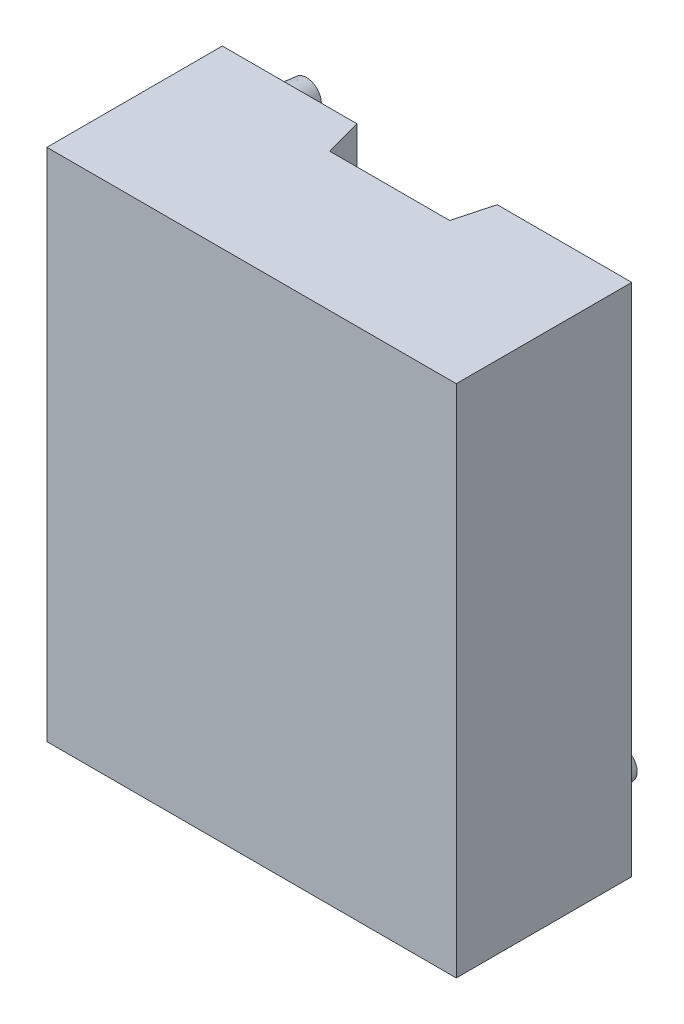
ISO-10303-21;
HEADER;
FILE_DESCRIPTION(('STEP AP214'),'2;1');
FILE_NAME('part.step','',(''),(''),'','','');
FILE_SCHEMA(('AUTOMOTIVE_DESIGN { 1 0 10303 214 1 1 1 1 }'));
ENDSEC;
DATA;
#1=APPLICATION_CONTEXT('core data for automotive mechanical design processes');
#2=APPLICATION_PROTOCOL_DEFINITION('international standard','automotive_design',2000,#1);
#3=PRODUCT_CONTEXT('',#1,'mechanical');
#4=PRODUCT('Part','Part','',(#3));
#5=PRODUCT_RELATED_PRODUCT_CATEGORY('part','',(#4));
#6=PRODUCT_DEFINITION_FORMATION('','',#4);
#7=PRODUCT_DEFINITION_CONTEXT('part definition',#1,'design');
#8=PRODUCT_DEFINITION('design','',#6,#7);
#9=PRODUCT_DEFINITION_SHAPE('','',#8);
#10=(LENGTH_UNIT() NAMED_UNIT(*) SI_UNIT(.MILLI.,.METRE.));
#11=(NAMED_UNIT(*) PLANE_ANGLE_UNIT() SI_UNIT($,.RADIAN.));
#12=(NAMED_UNIT(*) SI_UNIT($,.STERADIAN.) SOLID_ANGLE_UNIT());
#13=UNCERTAINTY_MEASURE_WITH_UNIT(LENGTH_MEASURE(1.E-05),#10,'distance_accuracy_value','');
#14=(GEOMETRIC_REPRESENTATION_CONTEXT(3) GLOBAL_UNCERTAINTY_ASSIGNED_CONTEXT((#13)) GLOBAL_UNIT_ASSIGNED_CONTEXT((#10,
#11,#12)) REPRESENTATION_CONTEXT('',''));
#15=CARTESIAN_POINT('',(0.,0.,0.));
#16=DIRECTION('',(0.,0.,1.));
#17=DIRECTION('',(1.,0.,0.));
#18=AXIS2_PLACEMENT_3D('',#15,#16,#17);
#19=CARTESIAN_POINT('',(0.,0.,0.));
#20=DIRECTION('',(0.,0.,1.));
#21=DIRECTION('',(1.,0.,0.));
#22=AXIS2_PLACEMENT_3D('',#19,#20,#21);
#23=PLANE('',#22);
#24=CARTESIAN_POINT('',(67.5,51.2727272727273,0.));
#25=DIRECTION('',(0.,0.,1.));
#26=DIRECTION('',(1.,0.,0.));
#27=AXIS2_PLACEMENT_3D('',#24,#25,#26);
#28=CIRCLE('',#27,8.);
#29=CARTESIAN_POINT('',(75.5,51.2727272727273,0.));
#30=VERTEX_POINT('',#29);
#31=EDGE_CURVE('E201',#30,#30,#28,.F.);
#32=ORIENTED_EDGE('',*,*,#31,.F.);
#33=EDGE_LOOP('',(#32));
#34=FACE_BOUND('',#33,.T.);
#35=DIRECTION('',(-1.,0.,0.));
#36=VECTOR('',#35,1.);
#37=CARTESIAN_POINT('',(60.,215.555555555556,0.));
#38=LINE('',#37,#36);
#39=CARTESIAN_POINT('',(60.,215.555555555556,0.));
#40=VERTEX_POINT('',#39);
#41=CARTESIAN_POINT('',(30.,215.555555555556,0.));
#42=VERTEX_POINT('',#41);
#43=EDGE_CURVE('E295',#40,#42,#38,.T.);
#44=ORIENTED_EDGE('',*,*,#43,.T.);
#45=DIRECTION('',(0.,1.,0.));
#46=VECTOR('',#45,1.);
#47=CARTESIAN_POINT('',(30.,212.370578729323,0.));
#48=LINE('',#47,#46);
#49=CARTESIAN_POINT('',(30.,247.272727272727,0.));
#50=VERTEX_POINT('',#49);
#51=EDGE_CURVE('E243',#42,#50,#48,.T.);
#52=ORIENTED_EDGE('',*,*,#51,.T.);
#53=DIRECTION('',(1.,0.,0.));
#54=VECTOR('',#53,1.);
#55=CARTESIAN_POINT('',(87.5,247.272727272727,0.));
#56=LINE('',#55,#54);
#57=CARTESIAN_POINT('',(87.5,247.272727272727,0.));
#58=VERTEX_POINT('',#57);
#59=EDGE_CURVE('E314',#50,#58,#56,.T.);
#60=ORIENTED_EDGE('',*,*,#59,.T.);
#61=DIRECTION('',(0.,-1.,0.));
#62=VECTOR('',#61,1.);
#63=CARTESIAN_POINT('',(87.5,27.2727272727273,0.));
#64=LINE('',#63,#62);
#65=CARTESIAN_POINT('',(87.5,27.2727272727273,0.));
#66=VERTEX_POINT('',#65);
#67=EDGE_CURVE('E211',#58,#66,#64,.T.);
#68=ORIENTED_EDGE('',*,*,#67,.T.);
#69=DIRECTION('',(-1.,0.,0.));
#70=VECTOR('',#69,1.);
#71=CARTESIAN_POINT('',(87.5,27.2727272727273,0.));
#72=LINE('',#71,#70);
#73=CARTESIAN_POINT('',(40.4040404040404,27.2727272727273,0.));
#74=VERTEX_POINT('',#73);
#75=EDGE_CURVE('E207',#66,#74,#72,.T.);
#76=ORIENTED_EDGE('',*,*,#75,.T.);
#77=DIRECTION('',(0.,1.,0.));
#78=VECTOR('',#77,1.);
#79=CARTESIAN_POINT('',(40.4040404040404,155.555555555556,0.));
#80=LINE('',#79,#78);
#81=CARTESIAN_POINT('',(40.4040404040404,52.6332114091182,0.));
#82=VERTEX_POINT('',#81);
#83=EDGE_CURVE('E210',#74,#82,#80,.T.);
#84=ORIENTED_EDGE('',*,*,#83,.T.);
#85=CARTESIAN_POINT('',(34.3434343434344,52.6332114091182,0.));
#86=DIRECTION('',(0.,0.,1.));
#87=DIRECTION('',(1.,0.,0.));
#88=AXIS2_PLACEMENT_3D('',#85,#86,#87);
#89=CIRCLE('',#88,6.06060606060606);
#90=CARTESIAN_POINT('',(40.2366907190739,54.0475929392717,0.));
#91=VERTEX_POINT('',#90);
#92=EDGE_CURVE('E276',#82,#91,#89,.T.);
#93=ORIENTED_EDGE('',*,*,#92,.T.);
#94=DIRECTION('',(-0.233372952475325,0.972387301980517,0.));
#95=VECTOR('',#94,1.);
#96=CARTESIAN_POINT('',(0.,221.700470935412,0.));
#97=LINE('',#96,#95);
#98=CARTESIAN_POINT('',(30.4703799879969,94.7405543187591,0.));
#99=VERTEX_POINT('',#98);
#100=EDGE_CURVE('E272',#91,#99,#97,.T.);
#101=ORIENTED_EDGE('',*,*,#100,.T.);
#102=CARTESIAN_POINT('',(36.3636363636364,96.1549358489125,0.));
#103=DIRECTION('',(0.,0.,1.));
#104=DIRECTION('',(1.,0.,0.));
#105=AXIS2_PLACEMENT_3D('',#102,#103,#104);
#106=CIRCLE('',#105,6.06060606060606);
#107=CARTESIAN_POINT('',(30.3030303030303,96.1549358489125,0.));
#108=VERTEX_POINT('',#107);
#109=EDGE_CURVE('E174',#108,#99,#106,.T.);
#110=ORIENTED_EDGE('',*,*,#109,.F.);
#111=DIRECTION('',(0.,1.,0.));
#112=VECTOR('',#111,1.);
#113=CARTESIAN_POINT('',(30.3030303030303,155.555555555556,0.));
#114=LINE('',#113,#112);
#115=CARTESIAN_POINT('',(30.3030303030303,185.555555555556,0.));
#116=VERTEX_POINT('',#115);
#117=EDGE_CURVE('E61',#108,#116,#114,.T.);
#118=ORIENTED_EDGE('',*,*,#117,.T.);
#119=DIRECTION('',(1.,0.,0.));
#120=VECTOR('',#119,1.);
#121=CARTESIAN_POINT('',(60.,185.555555555556,0.));
#122=LINE('',#121,#120);
#123=CARTESIAN_POINT('',(60.,185.555555555556,0.));
#124=VERTEX_POINT('',#123);
#125=EDGE_CURVE('E347',#124,#116,#122,.F.);
#126=ORIENTED_EDGE('',*,*,#125,.F.);
#127=DIRECTION('',(0.,1.,0.));
#128=VECTOR('',#127,1.);
#129=CARTESIAN_POINT('',(60.,185.555555555556,0.));
#130=LINE('',#129,#128);
#131=EDGE_CURVE('E297',#124,#40,#130,.T.);
#132=ORIENTED_EDGE('',*,*,#131,.T.);
#133=EDGE_LOOP('',(#44,#52,#60,#68,#76,#84,#93,#101,#110,#118,#126,#132));
#134=FACE_BOUND('',#133,.T.);
#135=ADVANCED_FACE('F37',(#34,#134),#23,.F.);
#136=CARTESIAN_POINT('',(87.5,27.2727272727273,75.));
#137=DIRECTION('',(0.,-1.,0.));
#138=DIRECTION('',(1.,0.,0.));
#139=AXIS2_PLACEMENT_3D('',#136,#137,#138);
#140=PLANE('',#139);
#141=CARTESIAN_POINT('',(60.,27.2727272727273,50.));
#142=DIRECTION('',(0.,-1.,0.));
#143=DIRECTION('',(1.,0.,0.));
#144=AXIS2_PLACEMENT_3D('',#141,#142,#143);
#145=CIRCLE('',#144,8.00000000000001);
#146=CARTESIAN_POINT('',(68.,27.2727272727273,50.));
#147=VERTEX_POINT('',#146);
#148=EDGE_CURVE('E246',#147,#147,#145,.T.);
#149=ORIENTED_EDGE('',*,*,#148,.F.);
#150=EDGE_LOOP('',(#149));
#151=FACE_BOUND('',#150,.T.);
#152=CARTESIAN_POINT('',(-60.,27.2727272727273,50.));
#153=DIRECTION('',(0.,-1.,0.));
#154=DIRECTION('',(1.,0.,0.));
#155=AXIS2_PLACEMENT_3D('',#152,#153,#154);
#156=CIRCLE('',#155,8.);
#157=CARTESIAN_POINT('',(-52.,27.2727272727273,50.));
#158=VERTEX_POINT('',#157);
#159=EDGE_CURVE('E260',#158,#158,#156,.T.);
#160=ORIENTED_EDGE('',*,*,#159,.F.);
#161=EDGE_LOOP('',(#160));
#162=FACE_BOUND('',#161,.T.);
#163=CARTESIAN_POINT('',(0.,27.2727272727273,0.));
#164=DIRECTION('',(0.,1.,0.));
#165=DIRECTION('',(0.,0.,1.));
#166=AXIS2_PLACEMENT_3D('',#163,#164,#165);
#167=CIRCLE('',#166,40.4040404040404);
#168=CARTESIAN_POINT('',(-40.4040404040404,27.2727272727273,0.));
#169=VERTEX_POINT('',#168);
#170=EDGE_CURVE('E191',#169,#74,#167,.T.);
#171=ORIENTED_EDGE('',*,*,#170,.T.);
#172=ORIENTED_EDGE('',*,*,#75,.F.);
#173=DIRECTION('',(0.,0.,-1.));
#174=VECTOR('',#173,1.);
#175=CARTESIAN_POINT('',(87.5,27.2727272727273,75.));
#176=LINE('',#175,#174);
#177=CARTESIAN_POINT('',(87.5,27.2727272727273,75.));
#178=VERTEX_POINT('',#177);
#179=EDGE_CURVE('E299',#178,#66,#176,.T.);
#180=ORIENTED_EDGE('',*,*,#179,.F.);
#181=DIRECTION('',(-1.,0.,0.));
#182=VECTOR('',#181,1.);
#183=CARTESIAN_POINT('',(87.5,27.2727272727273,75.));
#184=LINE('',#183,#182);
#185=CARTESIAN_POINT('',(-87.5,27.2727272727273,75.));
#186=VERTEX_POINT('',#185);
#187=EDGE_CURVE('E193',#178,#186,#184,.T.);
#188=ORIENTED_EDGE('',*,*,#187,.T.);
#189=DIRECTION('',(0.,0.,-1.));
#190=VECTOR('',#189,1.);
#191=CARTESIAN_POINT('',(-87.5,27.2727272727273,75.));
#192=LINE('',#191,#190);
#193=CARTESIAN_POINT('',(-87.5,27.2727272727273,0.));
#194=VERTEX_POINT('',#193);
#195=EDGE_CURVE('E298',#186,#194,#192,.T.);
#196=ORIENTED_EDGE('',*,*,#195,.T.);
#197=EDGE_CURVE('E212',#169,#194,#72,.T.);
#198=ORIENTED_EDGE('',*,*,#197,.F.);
#199=EDGE_LOOP('',(#171,#172,#180,#188,#196,#198));
#200=FACE_BOUND('',#199,.T.);
#201=ADVANCED_FACE('F39',(#151,#162,#200),#140,.T.);
#202=CARTESIAN_POINT('',(-67.5,231.272727272727,0.));
#203=DIRECTION('',(0.,0.,1.));
#204=DIRECTION('',(1.,0.,0.));
#205=AXIS2_PLACEMENT_3D('',#202,#203,#204);
#206=CIRCLE('',#205,8.);
#207=CARTESIAN_POINT('',(-59.5,231.272727272727,0.));
#208=VERTEX_POINT('',#207);
#209=EDGE_CURVE('E215',#208,#208,#206,.F.);
#210=ORIENTED_EDGE('',*,*,#209,.F.);
#211=EDGE_LOOP('',(#210));
#212=FACE_BOUND('',#211,.T.);
#213=CARTESIAN_POINT('',(-87.5,247.272727272727,0.));
#214=VERTEX_POINT('',#213);
#215=CARTESIAN_POINT('',(-30.,247.272727272727,0.));
#216=VERTEX_POINT('',#215);
#217=EDGE_CURVE('E311',#214,#216,#56,.T.);
#218=ORIENTED_EDGE('',*,*,#217,.T.);
#219=DIRECTION('',(0.,1.,0.));
#220=VECTOR('',#219,1.);
#221=CARTESIAN_POINT('',(-30.,212.370578729323,0.));
#222=LINE('',#221,#220);
#223=CARTESIAN_POINT('',(-30.,215.555555555556,0.));
#224=VERTEX_POINT('',#223);
#225=EDGE_CURVE('E248',#224,#216,#222,.T.);
#226=ORIENTED_EDGE('',*,*,#225,.F.);
#227=CARTESIAN_POINT('',(-60.,215.555555555556,0.));
#228=VERTEX_POINT('',#227);
#229=EDGE_CURVE('E352',#224,#228,#38,.T.);
#230=ORIENTED_EDGE('',*,*,#229,.T.);
#231=DIRECTION('',(0.,1.,0.));
#232=VECTOR('',#231,1.);
#233=CARTESIAN_POINT('',(-60.,185.555555555556,0.));
#234=LINE('',#233,#232);
#235=CARTESIAN_POINT('',(-60.,185.555555555556,0.));
#236=VERTEX_POINT('',#235);
#237=EDGE_CURVE('E355',#236,#228,#234,.T.);
#238=ORIENTED_EDGE('',*,*,#237,.F.);
#239=DIRECTION('',(1.,0.,0.));
#240=VECTOR('',#239,1.);
#241=CARTESIAN_POINT('',(60.,185.555555555556,0.));
#242=LINE('',#241,#240);
#243=CARTESIAN_POINT('',(-30.3030303030303,185.555555555556,0.));
#244=VERTEX_POINT('',#243);
#245=EDGE_CURVE('E358',#244,#236,#242,.F.);
#246=ORIENTED_EDGE('',*,*,#245,.F.);
#247=DIRECTION('',(0.,1.,0.));
#248=VECTOR('',#247,1.);
#249=CARTESIAN_POINT('',(-30.3030303030303,155.555555555556,0.));
#250=LINE('',#249,#248);
#251=CARTESIAN_POINT('',(-30.3030303030303,96.1549358489125,0.));
#252=VERTEX_POINT('',#251);
#253=EDGE_CURVE('E287',#244,#252,#250,.F.);
#254=ORIENTED_EDGE('',*,*,#253,.T.);
#255=CARTESIAN_POINT('',(-36.3636363636364,96.1549358489125,0.));
#256=DIRECTION('',(0.,0.,1.));
#257=DIRECTION('',(1.,0.,0.));
#258=AXIS2_PLACEMENT_3D('',#255,#256,#257);
#259=CIRCLE('',#258,6.06060606060606);
#260=CARTESIAN_POINT('',(-30.4703799879969,94.7405543187591,0.));
#261=VERTEX_POINT('',#260);
#262=EDGE_CURVE('E183',#261,#252,#259,.T.);
#263=ORIENTED_EDGE('',*,*,#262,.F.);
#264=DIRECTION('',(-0.233372952475325,-0.972387301980517,0.));
#265=VECTOR('',#264,1.);
#266=CARTESIAN_POINT('',(0.,221.700470935412,0.));
#267=LINE('',#266,#265);
#268=CARTESIAN_POINT('',(-40.2366907190739,54.0475929392717,0.));
#269=VERTEX_POINT('',#268);
#270=EDGE_CURVE('E283',#261,#269,#267,.T.);
#271=ORIENTED_EDGE('',*,*,#270,.T.);
#272=CARTESIAN_POINT('',(-34.3434343434344,52.6332114091182,0.));
#273=DIRECTION('',(0.,0.,1.));
#274=DIRECTION('',(1.,0.,0.));
#275=AXIS2_PLACEMENT_3D('',#272,#273,#274);
#276=CIRCLE('',#275,6.06060606060606);
#277=CARTESIAN_POINT('',(-40.4040404040404,52.6332114091182,0.));
#278=VERTEX_POINT('',#277);
#279=EDGE_CURVE('E286',#269,#278,#276,.T.);
#280=ORIENTED_EDGE('',*,*,#279,.T.);
#281=DIRECTION('',(0.,1.,0.));
#282=VECTOR('',#281,1.);
#283=CARTESIAN_POINT('',(-40.4040404040404,155.555555555556,0.));
#284=LINE('',#283,#282);
#285=EDGE_CURVE('E290',#278,#169,#284,.F.);
#286=ORIENTED_EDGE('',*,*,#285,.T.);
#287=ORIENTED_EDGE('',*,*,#197,.T.);
#288=DIRECTION('',(0.,1.,0.));
#289=VECTOR('',#288,1.);
#290=CARTESIAN_POINT('',(-87.5,27.2727272727273,0.));
#291=LINE('',#290,#289);
#292=EDGE_CURVE('E315',#194,#214,#291,.T.);
#293=ORIENTED_EDGE('',*,*,#292,.T.);
#294=EDGE_LOOP('',(#218,#226,#230,#238,#246,#254,#263,#271,#280,#286,#287,#293));
#295=FACE_BOUND('',#294,.T.);
#296=ADVANCED_FACE('F428',(#212,#295),#23,.F.);
#297=CARTESIAN_POINT('',(87.5,27.2727272727273,75.));
#298=DIRECTION('',(1.,0.,0.));
#299=DIRECTION('',(0.,0.,-1.));
#300=AXIS2_PLACEMENT_3D('',#297,#298,#299);
#301=PLANE('',#300);
#302=ORIENTED_EDGE('',*,*,#67,.F.);
#303=DIRECTION('',(0.,0.,-1.));
#304=VECTOR('',#303,1.);
#305=CARTESIAN_POINT('',(87.5,247.272727272727,75.));
#306=LINE('',#305,#304);
#307=CARTESIAN_POINT('',(87.5,247.272727272727,75.));
#308=VERTEX_POINT('',#307);
#309=EDGE_CURVE('E308',#308,#58,#306,.T.);
#310=ORIENTED_EDGE('',*,*,#309,.F.);
#311=DIRECTION('',(0.,-1.,0.));
#312=VECTOR('',#311,1.);
#313=CARTESIAN_POINT('',(87.5,27.2727272727273,75.));
#314=LINE('',#313,#312);
#315=EDGE_CURVE('E275',#308,#178,#314,.T.);
#316=ORIENTED_EDGE('',*,*,#315,.T.);
#317=ORIENTED_EDGE('',*,*,#179,.T.);
#318=EDGE_LOOP('',(#302,#310,#316,#317));
#319=FACE_BOUND('',#318,.T.);
#320=ADVANCED_FACE('F422',(#319),#301,.T.);
#321=CARTESIAN_POINT('',(87.5,247.272727272727,75.));
#322=DIRECTION('',(0.,1.,0.));
#323=DIRECTION('',(-1.,0.,0.));
#324=AXIS2_PLACEMENT_3D('',#321,#322,#323);
#325=PLANE('',#324);
#326=DIRECTION('',(0.258819045102521,0.,-0.965925826289068));
#327=VECTOR('',#326,1.);
#328=CARTESIAN_POINT('',(25.7128129211021,247.272727272727,16.));
#329=LINE('',#328,#327);
#330=CARTESIAN_POINT('',(25.7128129211021,247.272727272727,16.));
#331=VERTEX_POINT('',#330);
#332=EDGE_CURVE('E254',#331,#50,#329,.T.);
#333=ORIENTED_EDGE('',*,*,#332,.F.);
#334=DIRECTION('',(1.,0.,0.));
#335=VECTOR('',#334,1.);
#336=CARTESIAN_POINT('',(-25.712812921102,247.272727272727,16.));
#337=LINE('',#336,#335);
#338=CARTESIAN_POINT('',(-25.712812921102,247.272727272727,16.));
#339=VERTEX_POINT('',#338);
#340=EDGE_CURVE('E239',#339,#331,#337,.T.);
#341=ORIENTED_EDGE('',*,*,#340,.F.);
#342=DIRECTION('',(0.258819045102522,0.,0.965925826289068));
#343=VECTOR('',#342,1.);
#344=CARTESIAN_POINT('',(-30.,247.272727272727,0.));
#345=LINE('',#344,#343);
#346=EDGE_CURVE('E644',#216,#339,#345,.T.);
#347=ORIENTED_EDGE('',*,*,#346,.F.);
#348=ORIENTED_EDGE('',*,*,#217,.F.);
#349=DIRECTION('',(0.,0.,-1.));
#350=VECTOR('',#349,1.);
#351=CARTESIAN_POINT('',(-87.5,247.272727272727,75.));
#352=LINE('',#351,#350);
#353=CARTESIAN_POINT('',(-87.5,247.272727272727,75.));
#354=VERTEX_POINT('',#353);
#355=EDGE_CURVE('E166',#354,#214,#352,.T.);
#356=ORIENTED_EDGE('',*,*,#355,.F.);
#357=DIRECTION('',(1.,0.,0.));
#358=VECTOR('',#357,1.);
#359=CARTESIAN_POINT('',(87.5,247.272727272727,75.));
#360=LINE('',#359,#358);
#361=EDGE_CURVE('E302',#354,#308,#360,.T.);
#362=ORIENTED_EDGE('',*,*,#361,.T.);
#363=ORIENTED_EDGE('',*,*,#309,.T.);
#364=ORIENTED_EDGE('',*,*,#59,.F.);
#365=EDGE_LOOP('',(#333,#341,#347,#348,#356,#362,#363,#364));
#366=FACE_BOUND('',#365,.T.);
#367=ADVANCED_FACE('F417',(#366),#325,.T.);
#368=CARTESIAN_POINT('',(-87.5,27.2727272727273,75.));
#369=DIRECTION('',(-1.,0.,0.));
#370=DIRECTION('',(0.,-1.,0.));
#371=AXIS2_PLACEMENT_3D('',#368,#369,#370);
#372=PLANE('',#371);
#373=ORIENTED_EDGE('',*,*,#292,.F.);
#374=ORIENTED_EDGE('',*,*,#195,.F.);
#375=DIRECTION('',(0.,1.,0.));
#376=VECTOR('',#375,1.);
#377=CARTESIAN_POINT('',(-87.5,27.2727272727273,75.));
#378=LINE('',#377,#376);
#379=EDGE_CURVE('E307',#186,#354,#378,.T.);
#380=ORIENTED_EDGE('',*,*,#379,.T.);
#381=ORIENTED_EDGE('',*,*,#355,.T.);
#382=EDGE_LOOP('',(#373,#374,#380,#381));
#383=FACE_BOUND('',#382,.T.);
#384=ADVANCED_FACE('F496',(#383),#372,.T.);
#385=CARTESIAN_POINT('',(0.,0.,75.));
#386=DIRECTION('',(0.,0.,1.));
#387=DIRECTION('',(1.,0.,0.));
#388=AXIS2_PLACEMENT_3D('',#385,#386,#387);
#389=PLANE('',#388);
#390=ORIENTED_EDGE('',*,*,#315,.F.);
#391=ORIENTED_EDGE('',*,*,#361,.F.);
#392=ORIENTED_EDGE('',*,*,#379,.F.);
#393=ORIENTED_EDGE('',*,*,#187,.F.);
#394=EDGE_LOOP('',(#390,#391,#392,#393));
#395=FACE_BOUND('',#394,.T.);
#396=ADVANCED_FACE('F499',(#395),#389,.T.);
#397=CARTESIAN_POINT('',(0.,155.555555555556,0.));
#398=DIRECTION('',(0.,-1.,0.));
#399=DIRECTION('',(0.,0.,-1.));
#400=AXIS2_PLACEMENT_3D('',#397,#398,#399);
#401=PLANE('',#400);
#402=DIRECTION('',(0.104528463267654,0.,0.994521895368273));
#403=VECTOR('',#402,1.);
#404=CARTESIAN_POINT('',(-30.1370271323719,155.555555555556,3.1675291899289));
#405=LINE('',#404,#403);
#406=CARTESIAN_POINT('',(-30.1370271323719,155.555555555556,3.1675291899289));
#407=VERTEX_POINT('',#406);
#408=CARTESIAN_POINT('',(-27.2849710393285,155.555555555556,30.3030303030303));
#409=VERTEX_POINT('',#408);
#410=EDGE_CURVE('E159',#407,#409,#405,.T.);
#411=ORIENTED_EDGE('',*,*,#410,.T.);
#412=DIRECTION('',(1.,0.,0.));
#413=VECTOR('',#412,1.);
#414=CARTESIAN_POINT('',(-27.2849710393285,155.555555555556,30.3030303030303));
#415=LINE('',#414,#413);
#416=CARTESIAN_POINT('',(0.,155.555555555556,30.3030303030303));
#417=VERTEX_POINT('',#416);
#418=EDGE_CURVE('E165',#409,#417,#415,.T.);
#419=ORIENTED_EDGE('',*,*,#418,.T.);
#420=CARTESIAN_POINT('',(0.,155.555555555556,0.));
#421=DIRECTION('',(0.,-1.,0.));
#422=DIRECTION('',(0.,0.,-1.));
#423=AXIS2_PLACEMENT_3D('',#420,#421,#422);
#424=CIRCLE('',#423,30.3030303030303);
#425=EDGE_CURVE('E149',#407,#417,#424,.F.);
#426=ORIENTED_EDGE('',*,*,#425,.F.);
#427=EDGE_LOOP('',(#411,#419,#426));
#428=FACE_BOUND('',#427,.T.);
#429=ADVANCED_FACE('F168',(#428),#401,.F.);
#430=CARTESIAN_POINT('',(27.2849710393285,155.555555555556,30.3030303030303));
#431=VERTEX_POINT('',#430);
#432=EDGE_CURVE('E205',#417,#431,#415,.T.);
#433=ORIENTED_EDGE('',*,*,#432,.T.);
#434=DIRECTION('',(0.104528463267654,0.,-0.994521895368273));
#435=VECTOR('',#434,1.);
#436=CARTESIAN_POINT('',(30.1370271323719,155.555555555556,3.1675291899289));
#437=LINE('',#436,#435);
#438=CARTESIAN_POINT('',(30.1370271323719,155.555555555556,3.1675291899289));
#439=VERTEX_POINT('',#438);
#440=EDGE_CURVE('E202',#431,#439,#437,.T.);
#441=ORIENTED_EDGE('',*,*,#440,.T.);
#442=EDGE_CURVE('E170',#417,#439,#424,.F.);
#443=ORIENTED_EDGE('',*,*,#442,.F.);
#444=EDGE_LOOP('',(#433,#441,#443));
#445=FACE_BOUND('',#444,.T.);
#446=ADVANCED_FACE('F446',(#445),#401,.F.);
#447=CARTESIAN_POINT('',(-30.1370271323719,155.555555555556,3.1675291899289));
#448=DIRECTION('',(-0.994521895368273,0.,0.104528463267654));
#449=DIRECTION('',(0.104528463267654,0.,0.994521895368273));
#450=AXIS2_PLACEMENT_3D('',#447,#448,#449);
#451=PLANE('',#450);
#452=DIRECTION('',(-0.103962051184499,-0.103962051184498,-0.989132844377854));
#453=VECTOR('',#452,1.);
#454=CARTESIAN_POINT('',(-29.4921388904512,186.533364530665,9.30323095580581));
#455=LINE('',#454,#453);
#456=CARTESIAN_POINT('',(-30.1370271323719,185.888476288745,3.1675291899289));
#457=VERTEX_POINT('',#456);
#458=CARTESIAN_POINT('',(-27.2849710393285,188.740532381788,30.3030303030303));
#459=VERTEX_POINT('',#458);
#460=EDGE_CURVE('E156',#457,#459,#455,.F.);
#461=ORIENTED_EDGE('',*,*,#460,.T.);
#462=DIRECTION('',(0.,1.,0.));
#463=VECTOR('',#462,1.);
#464=CARTESIAN_POINT('',(-27.2849710393285,155.555555555556,30.3030303030303));
#465=LINE('',#464,#463);
#466=EDGE_CURVE('E161',#409,#459,#465,.T.);
#467=ORIENTED_EDGE('',*,*,#466,.F.);
#468=ORIENTED_EDGE('',*,*,#410,.F.);
#469=DIRECTION('',(0.,1.,0.));
#470=VECTOR('',#469,1.);
#471=CARTESIAN_POINT('',(-30.1370271323719,155.555555555556,3.1675291899289));
#472=LINE('',#471,#470);
#473=EDGE_CURVE('E145',#407,#457,#472,.T.);
#474=ORIENTED_EDGE('',*,*,#473,.T.);
#475=EDGE_LOOP('',(#461,#467,#468,#474));
#476=FACE_BOUND('',#475,.T.);
#477=ADVANCED_FACE('F160',(#476),#451,.F.);
#478=CARTESIAN_POINT('',(30.1370271323719,155.555555555556,3.1675291899289));
#479=DIRECTION('',(0.994521895368273,0.,0.104528463267654));
#480=DIRECTION('',(0.104528463267654,0.,-0.994521895368273));
#481=AXIS2_PLACEMENT_3D('',#478,#479,#480);
#482=PLANE('',#481);
#483=DIRECTION('',(-0.103962051184499,0.103962051184498,0.989132844377854));
#484=VECTOR('',#483,1.);
#485=CARTESIAN_POINT('',(30.7891118608298,185.236391560287,-3.03664257165169));
#486=LINE('',#485,#484);
#487=CARTESIAN_POINT('',(27.2849710393285,188.740532381788,30.3030303030303));
#488=VERTEX_POINT('',#487);
#489=CARTESIAN_POINT('',(30.1370271323719,185.888476288745,3.1675291899289));
#490=VERTEX_POINT('',#489);
#491=EDGE_CURVE('E155',#488,#490,#486,.F.);
#492=ORIENTED_EDGE('',*,*,#491,.T.);
#493=DIRECTION('',(0.,1.,0.));
#494=VECTOR('',#493,1.);
#495=CARTESIAN_POINT('',(30.1370271323719,155.555555555556,3.1675291899289));
#496=LINE('',#495,#494);
#497=EDGE_CURVE('E173',#439,#490,#496,.T.);
#498=ORIENTED_EDGE('',*,*,#497,.F.);
#499=ORIENTED_EDGE('',*,*,#440,.F.);
#500=DIRECTION('',(0.,1.,0.));
#501=VECTOR('',#500,1.);
#502=CARTESIAN_POINT('',(27.2849710393285,155.555555555556,30.3030303030303));
#503=LINE('',#502,#501);
#504=EDGE_CURVE('E198',#431,#488,#503,.T.);
#505=ORIENTED_EDGE('',*,*,#504,.T.);
#506=EDGE_LOOP('',(#492,#498,#499,#505));
#507=FACE_BOUND('',#506,.T.);
#508=ADVANCED_FACE('F449',(#507),#482,.F.);
#509=CARTESIAN_POINT('',(-56.8150231737673,185.555555555556,30.3030303030303));
#510=DIRECTION('',(0.,0.,1.));
#511=DIRECTION('',(1.,0.,0.));
#512=AXIS2_PLACEMENT_3D('',#509,#510,#511);
#513=PLANE('',#512);
#514=ORIENTED_EDGE('',*,*,#418,.F.);
#515=ORIENTED_EDGE('',*,*,#466,.T.);
#516=DIRECTION('',(-1.,0.,0.));
#517=VECTOR('',#516,1.);
#518=CARTESIAN_POINT('',(60.,188.740532381788,30.3030303030303));
#519=LINE('',#518,#517);
#520=CARTESIAN_POINT('',(-56.8150231737674,188.740532381788,30.3030303030303));
#521=VERTEX_POINT('',#520);
#522=EDGE_CURVE('E190',#521,#459,#519,.F.);
#523=ORIENTED_EDGE('',*,*,#522,.F.);
#524=DIRECTION('',(0.,1.,0.));
#525=VECTOR('',#524,1.);
#526=CARTESIAN_POINT('',(-56.8150231737674,185.555555555556,30.3030303030303));
#527=LINE('',#526,#525);
#528=CARTESIAN_POINT('',(-56.8150231737674,212.370578729323,30.3030303030303));
#529=VERTEX_POINT('',#528);
#530=EDGE_CURVE('E197',#521,#529,#527,.T.);
#531=ORIENTED_EDGE('',*,*,#530,.T.);
#532=DIRECTION('',(1.,0.,0.));
#533=VECTOR('',#532,1.);
#534=CARTESIAN_POINT('',(60.,212.370578729323,30.3030303030303));
#535=LINE('',#534,#533);
#536=CARTESIAN_POINT('',(56.8150231737674,212.370578729323,30.3030303030303));
#537=VERTEX_POINT('',#536);
#538=EDGE_CURVE('E332',#529,#537,#535,.T.);
#539=ORIENTED_EDGE('',*,*,#538,.T.);
#540=DIRECTION('',(0.,1.,0.));
#541=VECTOR('',#540,1.);
#542=CARTESIAN_POINT('',(56.8150231737674,185.555555555556,30.3030303030303));
#543=LINE('',#542,#541);
#544=CARTESIAN_POINT('',(56.8150231737674,188.740532381788,30.3030303030303));
#545=VERTEX_POINT('',#544);
#546=EDGE_CURVE('E335',#545,#537,#543,.T.);
#547=ORIENTED_EDGE('',*,*,#546,.F.);
#548=DIRECTION('',(-1.,0.,0.));
#549=VECTOR('',#548,1.);
#550=CARTESIAN_POINT('',(60.,188.740532381788,30.3030303030303));
#551=LINE('',#550,#549);
#552=EDGE_CURVE('E334',#488,#545,#551,.F.);
#553=ORIENTED_EDGE('',*,*,#552,.F.);
#554=ORIENTED_EDGE('',*,*,#504,.F.);
#555=ORIENTED_EDGE('',*,*,#432,.F.);
#556=EDGE_LOOP('',(#514,#515,#523,#531,#539,#547,#553,#554,#555));
#557=FACE_BOUND('',#556,.T.);
#558=ADVANCED_FACE('F375',(#557),#513,.F.);
#559=CARTESIAN_POINT('',(60.,185.555555555556,0.));
#560=DIRECTION('',(0.,-0.994521895368273,0.104528463267654));
#561=DIRECTION('',(0.,-0.104528463267654,-0.994521895368273));
#562=AXIS2_PLACEMENT_3D('',#559,#560,#561);
#563=PLANE('',#562);
#564=ORIENTED_EDGE('',*,*,#552,.T.);
#565=DIRECTION('',(-0.103962051184498,0.103962051184498,0.989132844377854));
#566=VECTOR('',#565,1.);
#567=CARTESIAN_POINT('',(60.,185.555555555556,0.));
#568=LINE('',#567,#566);
#569=EDGE_CURVE('E341',#545,#124,#568,.F.);
#570=ORIENTED_EDGE('',*,*,#569,.T.);
#571=ORIENTED_EDGE('',*,*,#125,.T.);
#572=CARTESIAN_POINT('',(0.,185.555555555556,0.));
#573=DIRECTION('',(0.,-0.994521895368273,0.104528463267654));
#574=DIRECTION('',(0.,0.104528463267654,0.994521895368273));
#575=AXIS2_PLACEMENT_3D('',#572,#573,#574);
#576=ELLIPSE('',#575,30.4699478655611,30.3030303030303);
#577=EDGE_CURVE('E344',#116,#490,#576,.T.);
#578=ORIENTED_EDGE('',*,*,#577,.T.);
#579=ORIENTED_EDGE('',*,*,#491,.F.);
#580=EDGE_LOOP('',(#564,#570,#571,#578,#579));
#581=FACE_BOUND('',#580,.T.);
#582=ADVANCED_FACE('F383',(#581),#563,.F.);
#583=CARTESIAN_POINT('',(60.,185.555555555556,0.));
#584=DIRECTION('',(0.994521895368273,0.,0.104528463267654));
#585=DIRECTION('',(0.104528463267654,0.,-0.994521895368274));
#586=AXIS2_PLACEMENT_3D('',#583,#584,#585);
#587=PLANE('',#586);
#588=DIRECTION('',(0.103962051184498,0.103962051184498,-0.989132844377854));
#589=VECTOR('',#588,1.);
#590=CARTESIAN_POINT('',(60.,215.555555555556,0.));
#591=LINE('',#590,#589);
#592=EDGE_CURVE('E339',#537,#40,#591,.T.);
#593=ORIENTED_EDGE('',*,*,#592,.T.);
#594=ORIENTED_EDGE('',*,*,#131,.F.);
#595=ORIENTED_EDGE('',*,*,#569,.F.);
#596=ORIENTED_EDGE('',*,*,#546,.T.);
#597=EDGE_LOOP('',(#593,#594,#595,#596));
#598=FACE_BOUND('',#597,.T.);
#599=ADVANCED_FACE('F379',(#598),#587,.F.);
#600=CARTESIAN_POINT('',(-60.,185.555555555556,0.));
#601=DIRECTION('',(-0.994521895368273,0.,0.104528463267654));
#602=DIRECTION('',(0.104528463267654,0.,0.994521895368273));
#603=AXIS2_PLACEMENT_3D('',#600,#601,#602);
#604=PLANE('',#603);
#605=DIRECTION('',(0.103962051184498,-0.103962051184498,0.989132844377854));
#606=VECTOR('',#605,1.);
#607=CARTESIAN_POINT('',(-58.7030270296214,214.258582585177,12.3398735274574));
#608=LINE('',#607,#606);
#609=EDGE_CURVE('E338',#228,#529,#608,.T.);
#610=ORIENTED_EDGE('',*,*,#609,.T.);
#611=ORIENTED_EDGE('',*,*,#530,.F.);
#612=DIRECTION('',(-0.103962051184498,-0.103962051184498,-0.989132844377854));
#613=VECTOR('',#612,1.);
#614=CARTESIAN_POINT('',(-58.7030270296214,186.852528525934,12.3398735274574));
#615=LINE('',#614,#613);
#616=EDGE_CURVE('E177',#236,#521,#615,.F.);
#617=ORIENTED_EDGE('',*,*,#616,.F.);
#618=ORIENTED_EDGE('',*,*,#237,.T.);
#619=EDGE_LOOP('',(#610,#611,#617,#618));
#620=FACE_BOUND('',#619,.T.);
#621=ADVANCED_FACE('F367',(#620),#604,.F.);
#622=CARTESIAN_POINT('',(0.,185.555555555556,0.));
#623=DIRECTION('',(0.,-0.994521895368273,0.104528463267654));
#624=DIRECTION('',(0.,0.104528463267654,0.994521895368273));
#625=AXIS2_PLACEMENT_3D('',#622,#623,#624);
#626=ELLIPSE('',#625,30.4699478655611,30.3030303030303);
#627=EDGE_CURVE('E152',#457,#244,#626,.T.);
#628=ORIENTED_EDGE('',*,*,#627,.T.);
#629=ORIENTED_EDGE('',*,*,#245,.T.);
#630=ORIENTED_EDGE('',*,*,#616,.T.);
#631=ORIENTED_EDGE('',*,*,#522,.T.);
#632=ORIENTED_EDGE('',*,*,#460,.F.);
#633=EDGE_LOOP('',(#628,#629,#630,#631,#632));
#634=FACE_BOUND('',#633,.T.);
#635=ADVANCED_FACE('F442',(#634),#563,.F.);
#636=CARTESIAN_POINT('',(60.,215.555555555556,0.));
#637=DIRECTION('',(0.,0.994521895368273,0.104528463267654));
#638=DIRECTION('',(0.,-0.104528463267654,0.994521895368273));
#639=AXIS2_PLACEMENT_3D('',#636,#637,#638);
#640=PLANE('',#639);
#641=DIRECTION('',(1.,0.,0.));
#642=VECTOR('',#641,1.);
#643=CARTESIAN_POINT('',(60.,213.873887791305,16.));
#644=LINE('',#643,#642);
#645=CARTESIAN_POINT('',(-25.712812921102,213.873887791305,16.));
#646=VERTEX_POINT('',#645);
#647=CARTESIAN_POINT('',(25.7128129211021,213.873887791305,16.));
#648=VERTEX_POINT('',#647);
#649=EDGE_CURVE('E45',#646,#648,#644,.T.);
#650=ORIENTED_EDGE('',*,*,#649,.T.);
#651=DIRECTION('',(0.257495457140403,0.10100371216489,-0.960986128766158));
#652=VECTOR('',#651,1.);
#653=CARTESIAN_POINT('',(31.9891173134384,216.335795466659,-7.42348687596685));
#654=LINE('',#653,#652);
#655=EDGE_CURVE('E11',#648,#42,#654,.T.);
#656=ORIENTED_EDGE('',*,*,#655,.T.);
#657=ORIENTED_EDGE('',*,*,#43,.F.);
#658=ORIENTED_EDGE('',*,*,#592,.F.);
#659=ORIENTED_EDGE('',*,*,#538,.F.);
#660=ORIENTED_EDGE('',*,*,#609,.F.);
#661=ORIENTED_EDGE('',*,*,#229,.F.);
#662=DIRECTION('',(0.257495457140404,-0.10100371216489,0.960986128766158));
#663=VECTOR('',#662,1.);
#664=CARTESIAN_POINT('',(-24.0326480596849,213.214835822246,22.2704606279006));
#665=LINE('',#664,#663);
#666=EDGE_CURVE('E218',#224,#646,#665,.T.);
#667=ORIENTED_EDGE('',*,*,#666,.T.);
#668=EDGE_LOOP('',(#650,#656,#657,#658,#659,#660,#661,#667));
#669=FACE_BOUND('',#668,.T.);
#670=ADVANCED_FACE('F223',(#669),#640,.F.);
#671=CARTESIAN_POINT('',(0.,155.555555555556,0.));
#672=DIRECTION('',(0.,1.,0.));
#673=DIRECTION('',(0.,0.,1.));
#674=AXIS2_PLACEMENT_3D('',#671,#672,#673);
#675=CYLINDRICAL_SURFACE('',#674,40.4040404040404);
#676=ORIENTED_EDGE('',*,*,#170,.F.);
#677=ORIENTED_EDGE('',*,*,#285,.F.);
#678=CARTESIAN_POINT('',(0.,52.6332114091182,0.));
#679=DIRECTION('',(0.,1.,0.));
#680=DIRECTION('',(0.,0.,1.));
#681=AXIS2_PLACEMENT_3D('',#678,#679,#680);
#682=CIRCLE('',#681,40.4040404040404);
#683=EDGE_CURVE('E187',#278,#82,#682,.T.);
#684=ORIENTED_EDGE('',*,*,#683,.T.);
#685=ORIENTED_EDGE('',*,*,#83,.F.);
#686=EDGE_LOOP('',(#676,#677,#684,#685));
#687=FACE_BOUND('',#686,.T.);
#688=ADVANCED_FACE('F425',(#687),#675,.F.);
#689=CARTESIAN_POINT('',(0.,52.6332114091182,0.));
#690=DIRECTION('',(0.,1.,0.));
#691=DIRECTION('',(0.,0.,1.));
#692=AXIS2_PLACEMENT_3D('',#689,#690,#691);
#693=TOROIDAL_SURFACE('',#692,34.3434343434344,6.06060606060606);
#694=ORIENTED_EDGE('',*,*,#683,.F.);
#695=ORIENTED_EDGE('',*,*,#279,.F.);
#696=CARTESIAN_POINT('',(0.,54.0475929392717,0.));
#697=DIRECTION('',(0.,-1.,0.));
#698=DIRECTION('',(0.,0.,-1.));
#699=AXIS2_PLACEMENT_3D('',#696,#697,#698);
#700=CIRCLE('',#699,40.2366907190739);
#701=EDGE_CURVE('E180',#91,#269,#700,.T.);
#702=ORIENTED_EDGE('',*,*,#701,.F.);
#703=ORIENTED_EDGE('',*,*,#92,.F.);
#704=EDGE_LOOP('',(#694,#695,#702,#703));
#705=FACE_BOUND('',#704,.T.);
#706=ADVANCED_FACE('F432',(#705),#693,.F.);
#707=CARTESIAN_POINT('',(0.,95.4378446727864,0.));
#708=DIRECTION('',(0.,-1.,0.));
#709=DIRECTION('',(0.,0.,-1.));
#710=AXIS2_PLACEMENT_3D('',#707,#708,#709);
#711=CONICAL_SURFACE('',#710,30.3030303030303,0.235544980720864);
#712=CARTESIAN_POINT('',(0.,94.7405543187591,0.));
#713=DIRECTION('',(0.,1.,0.));
#714=DIRECTION('',(0.,0.,1.));
#715=AXIS2_PLACEMENT_3D('',#712,#713,#714);
#716=CIRCLE('',#715,30.4703799879969);
#717=EDGE_CURVE('E184',#261,#99,#716,.T.);
#718=ORIENTED_EDGE('',*,*,#717,.T.);
#719=ORIENTED_EDGE('',*,*,#100,.F.);
#720=ORIENTED_EDGE('',*,*,#701,.T.);
#721=ORIENTED_EDGE('',*,*,#270,.F.);
#722=EDGE_LOOP('',(#718,#719,#720,#721));
#723=FACE_BOUND('',#722,.T.);
#724=ADVANCED_FACE('F434',(#723),#711,.F.);
#725=CARTESIAN_POINT('',(0.,96.1549358489125,0.));
#726=DIRECTION('',(0.,-1.,0.));
#727=DIRECTION('',(0.,0.,-1.));
#728=AXIS2_PLACEMENT_3D('',#725,#726,#727);
#729=TOROIDAL_SURFACE('',#728,36.3636363636364,6.06060606060606);
#730=ORIENTED_EDGE('',*,*,#262,.T.);
#731=CARTESIAN_POINT('',(0.,96.1549358489125,0.));
#732=DIRECTION('',(0.,-1.,0.));
#733=DIRECTION('',(0.,0.,-1.));
#734=AXIS2_PLACEMENT_3D('',#731,#732,#733);
#735=CIRCLE('',#734,30.3030303030303);
#736=EDGE_CURVE('E171',#108,#252,#735,.T.);
#737=ORIENTED_EDGE('',*,*,#736,.F.);
#738=ORIENTED_EDGE('',*,*,#109,.T.);
#739=ORIENTED_EDGE('',*,*,#717,.F.);
#740=EDGE_LOOP('',(#730,#737,#738,#739));
#741=FACE_BOUND('',#740,.T.);
#742=ADVANCED_FACE('F438',(#741),#729,.T.);
#743=CARTESIAN_POINT('',(0.,155.555555555556,0.));
#744=DIRECTION('',(0.,1.,0.));
#745=DIRECTION('',(0.,0.,1.));
#746=AXIS2_PLACEMENT_3D('',#743,#744,#745);
#747=CYLINDRICAL_SURFACE('',#746,30.3030303030303);
#748=ORIENTED_EDGE('',*,*,#736,.T.);
#749=ORIENTED_EDGE('',*,*,#253,.F.);
#750=ORIENTED_EDGE('',*,*,#627,.F.);
#751=ORIENTED_EDGE('',*,*,#473,.F.);
#752=ORIENTED_EDGE('',*,*,#425,.T.);
#753=ORIENTED_EDGE('',*,*,#442,.T.);
#754=ORIENTED_EDGE('',*,*,#497,.T.);
#755=ORIENTED_EDGE('',*,*,#577,.F.);
#756=ORIENTED_EDGE('',*,*,#117,.F.);
#757=EDGE_LOOP('',(#748,#749,#750,#751,#752,#753,#754,#755,#756));
#758=FACE_BOUND('',#757,.T.);
#759=ADVANCED_FACE('F147',(#758),#747,.F.);
#760=CARTESIAN_POINT('',(67.5,51.2727272727273,0.));
#761=DIRECTION('',(0.,0.,1.));
#762=DIRECTION('',(-1.,0.,0.));
#763=AXIS2_PLACEMENT_3D('',#760,#761,#762);
#764=CONICAL_SURFACE('',#763,8.,0.10471975511966);
#765=CARTESIAN_POINT('',(67.5,51.2727272727273,-16.));
#766=DIRECTION('',(0.,0.,-1.));
#767=DIRECTION('',(-1.,0.,0.));
#768=AXIS2_PLACEMENT_3D('',#765,#766,#767);
#769=CIRCLE('',#768,6.31833223574917);
#770=CARTESIAN_POINT('',(61.1816677642508,51.2727272727273,-16.));
#771=VERTEX_POINT('',#770);
#772=EDGE_CURVE('E194',#771,#771,#769,.T.);
#773=ORIENTED_EDGE('',*,*,#772,.F.);
#774=EDGE_LOOP('',(#773));
#775=FACE_BOUND('',#774,.T.);
#776=ORIENTED_EDGE('',*,*,#31,.T.);
#777=EDGE_LOOP('',(#776));
#778=FACE_BOUND('',#777,.T.);
#779=ADVANCED_FACE('F487',(#775,#778),#764,.T.);
#780=CARTESIAN_POINT('',(67.5,51.2727272727273,-16.));
#781=DIRECTION('',(0.,0.,-1.));
#782=DIRECTION('',(-1.,0.,0.));
#783=AXIS2_PLACEMENT_3D('',#780,#781,#782);
#784=PLANE('',#783);
#785=ORIENTED_EDGE('',*,*,#772,.T.);
#786=EDGE_LOOP('',(#785));
#787=FACE_BOUND('',#786,.T.);
#788=ADVANCED_FACE('F477',(#787),#784,.T.);
#789=CARTESIAN_POINT('',(-67.5,231.272727272727,0.));
#790=DIRECTION('',(0.,0.,1.));
#791=DIRECTION('',(-1.,0.,0.));
#792=AXIS2_PLACEMENT_3D('',#789,#790,#791);
#793=CONICAL_SURFACE('',#792,8.,0.10471975511966);
#794=CARTESIAN_POINT('',(-67.5,231.272727272727,-16.));
#795=DIRECTION('',(0.,0.,-1.));
#796=DIRECTION('',(-1.,0.,0.));
#797=AXIS2_PLACEMENT_3D('',#794,#795,#796);
#798=CIRCLE('',#797,6.31833223574917);
#799=CARTESIAN_POINT('',(-73.8183322357492,231.272727272727,-16.));
#800=VERTEX_POINT('',#799);
#801=EDGE_CURVE('E266',#800,#800,#798,.T.);
#802=ORIENTED_EDGE('',*,*,#801,.F.);
#803=EDGE_LOOP('',(#802));
#804=FACE_BOUND('',#803,.T.);
#805=ORIENTED_EDGE('',*,*,#209,.T.);
#806=EDGE_LOOP('',(#805));
#807=FACE_BOUND('',#806,.T.);
#808=ADVANCED_FACE('F474',(#804,#807),#793,.T.);
#809=CARTESIAN_POINT('',(-67.5,231.272727272727,-16.));
#810=DIRECTION('',(0.,0.,-1.));
#811=DIRECTION('',(-1.,0.,0.));
#812=AXIS2_PLACEMENT_3D('',#809,#810,#811);
#813=PLANE('',#812);
#814=ORIENTED_EDGE('',*,*,#801,.T.);
#815=EDGE_LOOP('',(#814));
#816=FACE_BOUND('',#815,.T.);
#817=ADVANCED_FACE('F476',(#816),#813,.T.);
#818=CARTESIAN_POINT('',(-60.,27.2727272727273,50.));
#819=DIRECTION('',(0.,1.,0.));
#820=DIRECTION('',(1.,0.,0.));
#821=AXIS2_PLACEMENT_3D('',#818,#819,#820);
#822=CONICAL_SURFACE('',#821,8.,0.10471975511966);
#823=CARTESIAN_POINT('',(-60.,11.2727272727273,50.));
#824=DIRECTION('',(0.,-1.,0.));
#825=DIRECTION('',(1.,0.,0.));
#826=AXIS2_PLACEMENT_3D('',#823,#824,#825);
#827=CIRCLE('',#826,6.31833223574917);
#828=CARTESIAN_POINT('',(-53.6816677642508,11.2727272727273,50.));
#829=VERTEX_POINT('',#828);
#830=EDGE_CURVE('E263',#829,#829,#827,.T.);
#831=ORIENTED_EDGE('',*,*,#830,.F.);
#832=EDGE_LOOP('',(#831));
#833=FACE_BOUND('',#832,.T.);
#834=ORIENTED_EDGE('',*,*,#159,.T.);
#835=EDGE_LOOP('',(#834));
#836=FACE_BOUND('',#835,.T.);
#837=ADVANCED_FACE('F484',(#833,#836),#822,.T.);
#838=CARTESIAN_POINT('',(-60.,11.2727272727273,50.));
#839=DIRECTION('',(0.,-1.,0.));
#840=DIRECTION('',(1.,0.,0.));
#841=AXIS2_PLACEMENT_3D('',#838,#839,#840);
#842=PLANE('',#841);
#843=ORIENTED_EDGE('',*,*,#830,.T.);
#844=EDGE_LOOP('',(#843));
#845=FACE_BOUND('',#844,.T.);
#846=ADVANCED_FACE('F563',(#845),#842,.T.);
#847=CARTESIAN_POINT('',(60.,27.2727272727273,50.));
#848=DIRECTION('',(0.,1.,0.));
#849=DIRECTION('',(1.,0.,0.));
#850=AXIS2_PLACEMENT_3D('',#847,#848,#849);
#851=CONICAL_SURFACE('',#850,8.00000000000001,0.10471975511966);
#852=CARTESIAN_POINT('',(60.,11.2727272727273,50.));
#853=DIRECTION('',(0.,-1.,0.));
#854=DIRECTION('',(1.,0.,0.));
#855=AXIS2_PLACEMENT_3D('',#852,#853,#854);
#856=CIRCLE('',#855,6.31833223574918);
#857=CARTESIAN_POINT('',(66.3183322357492,11.2727272727273,50.));
#858=VERTEX_POINT('',#857);
#859=EDGE_CURVE('E257',#858,#858,#856,.T.);
#860=ORIENTED_EDGE('',*,*,#859,.F.);
#861=EDGE_LOOP('',(#860));
#862=FACE_BOUND('',#861,.T.);
#863=ORIENTED_EDGE('',*,*,#148,.T.);
#864=EDGE_LOOP('',(#863));
#865=FACE_BOUND('',#864,.T.);
#866=ADVANCED_FACE('F572',(#862,#865),#851,.T.);
#867=CARTESIAN_POINT('',(60.,11.2727272727273,50.));
#868=DIRECTION('',(0.,-1.,0.));
#869=DIRECTION('',(1.,0.,0.));
#870=AXIS2_PLACEMENT_3D('',#867,#868,#869);
#871=PLANE('',#870);
#872=ORIENTED_EDGE('',*,*,#859,.T.);
#873=EDGE_LOOP('',(#872));
#874=FACE_BOUND('',#873,.T.);
#875=ADVANCED_FACE('F582',(#874),#871,.T.);
#876=CARTESIAN_POINT('',(25.7128129211021,212.370578729323,16.));
#877=DIRECTION('',(0.965925826289068,0.,0.258819045102521));
#878=DIRECTION('',(0.258819045102521,0.,-0.965925826289068));
#879=AXIS2_PLACEMENT_3D('',#876,#877,#878);
#880=PLANE('',#879);
#881=DIRECTION('',(0.,1.,0.));
#882=VECTOR('',#881,1.);
#883=CARTESIAN_POINT('',(25.7128129211021,212.370578729323,16.));
#884=LINE('',#883,#882);
#885=EDGE_CURVE('E236',#648,#331,#884,.T.);
#886=ORIENTED_EDGE('',*,*,#885,.T.);
#887=ORIENTED_EDGE('',*,*,#332,.T.);
#888=ORIENTED_EDGE('',*,*,#51,.F.);
#889=ORIENTED_EDGE('',*,*,#655,.F.);
#890=EDGE_LOOP('',(#886,#887,#888,#889));
#891=FACE_BOUND('',#890,.T.);
#892=ADVANCED_FACE('F411',(#891),#880,.F.);
#893=CARTESIAN_POINT('',(-25.712812921102,212.370578729323,16.));
#894=DIRECTION('',(0.,0.,1.));
#895=DIRECTION('',(1.,0.,0.));
#896=AXIS2_PLACEMENT_3D('',#893,#894,#895);
#897=PLANE('',#896);
#898=DIRECTION('',(0.,1.,0.));
#899=VECTOR('',#898,1.);
#900=CARTESIAN_POINT('',(-25.712812921102,212.370578729323,16.));
#901=LINE('',#900,#899);
#902=EDGE_CURVE('E52',#646,#339,#901,.T.);
#903=ORIENTED_EDGE('',*,*,#902,.T.);
#904=ORIENTED_EDGE('',*,*,#340,.T.);
#905=ORIENTED_EDGE('',*,*,#885,.F.);
#906=ORIENTED_EDGE('',*,*,#649,.F.);
#907=EDGE_LOOP('',(#903,#904,#905,#906));
#908=FACE_BOUND('',#907,.T.);
#909=ADVANCED_FACE('F232',(#908),#897,.F.);
#910=CARTESIAN_POINT('',(-30.,212.370578729323,0.));
#911=DIRECTION('',(-0.965925826289068,0.,0.258819045102522));
#912=DIRECTION('',(0.258819045102522,0.,0.965925826289068));
#913=AXIS2_PLACEMENT_3D('',#910,#911,#912);
#914=PLANE('',#913);
#915=ORIENTED_EDGE('',*,*,#225,.T.);
#916=ORIENTED_EDGE('',*,*,#346,.T.);
#917=ORIENTED_EDGE('',*,*,#902,.F.);
#918=ORIENTED_EDGE('',*,*,#666,.F.);
#919=EDGE_LOOP('',(#915,#916,#917,#918));
#920=FACE_BOUND('',#919,.T.);
#921=ADVANCED_FACE('F629',(#920),#914,.F.);
#922=CLOSED_SHELL('',(#135,#201,#296,#320,#367,#384,#396,#429,#446,#477,#508,#558,#582,#599,
#621,#635,#670,#688,#706,#724,#742,#759,#779,#788,#808,#817,#837,#846,#866,#875,#892,#909,#921));
#923=MANIFOLD_SOLID_BREP('B2',#922);
#924=ADVANCED_BREP_SHAPE_REPRESENTATION('',(#18,#923),#14);
#925=SHAPE_DEFINITION_REPRESENTATION(#9,#924);
ENDSEC;
END-ISO-10303-21;
